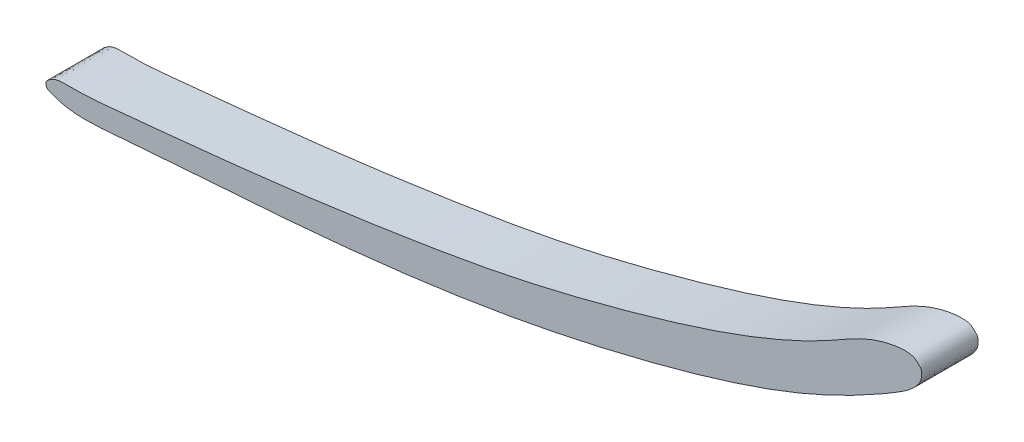
ISO-10303-21;
HEADER;
FILE_DESCRIPTION(('STEP AP214'),'2;1');
FILE_NAME('part.step','',(''),(''),'','','');
FILE_SCHEMA(('AUTOMOTIVE_DESIGN { 1 0 10303 214 1 1 1 1 }'));
ENDSEC;
DATA;
#1=APPLICATION_CONTEXT('core data for automotive mechanical design processes');
#2=APPLICATION_PROTOCOL_DEFINITION('international standard','automotive_design',2000,#1);
#3=PRODUCT_CONTEXT('',#1,'mechanical');
#4=PRODUCT('Part','Part','',(#3));
#5=PRODUCT_RELATED_PRODUCT_CATEGORY('part','',(#4));
#6=PRODUCT_DEFINITION_FORMATION('','',#4);
#7=PRODUCT_DEFINITION_CONTEXT('part definition',#1,'design');
#8=PRODUCT_DEFINITION('design','',#6,#7);
#9=PRODUCT_DEFINITION_SHAPE('','',#8);
#10=(LENGTH_UNIT() NAMED_UNIT(*) SI_UNIT(.MILLI.,.METRE.));
#11=(NAMED_UNIT(*) PLANE_ANGLE_UNIT() SI_UNIT($,.RADIAN.));
#12=(NAMED_UNIT(*) SI_UNIT($,.STERADIAN.) SOLID_ANGLE_UNIT());
#13=UNCERTAINTY_MEASURE_WITH_UNIT(LENGTH_MEASURE(1.E-05),#10,'distance_accuracy_value','');
#14=(GEOMETRIC_REPRESENTATION_CONTEXT(3) GLOBAL_UNCERTAINTY_ASSIGNED_CONTEXT((#13)) GLOBAL_UNIT_ASSIGNED_CONTEXT((#10,
#11,#12)) REPRESENTATION_CONTEXT('',''));
#15=CARTESIAN_POINT('',(0.,0.,0.));
#16=DIRECTION('',(0.,0.,1.));
#17=DIRECTION('',(1.,0.,0.));
#18=AXIS2_PLACEMENT_3D('',#15,#16,#17);
#19=CARTESIAN_POINT('',(71.7110463730999,0.,364.));
#20=CARTESIAN_POINT('',(71.6826823893611,0.0815190251850142,364.));
#21=CARTESIAN_POINT('',(71.6266237909105,0.1468718725404,364.));
#22=CARTESIAN_POINT('',(71.5095659980875,0.270463477702912,364.));
#23=CARTESIAN_POINT('',(71.4474889434878,0.328655276440096,364.));
#24=CARTESIAN_POINT('',(71.2644784652483,0.506502049665254,364.));
#25=CARTESIAN_POINT('',(71.1431501824002,0.627213291922239,364.));
#26=CARTESIAN_POINT('',(70.9442885353693,0.784419450167801,364.));
#27=CARTESIAN_POINT('',(70.8756582462795,0.833233589199096,364.));
#28=CARTESIAN_POINT('',(70.7298489884909,0.917771400414497,364.));
#29=CARTESIAN_POINT('',(70.6524054015472,0.953913066234865,364.));
#30=CARTESIAN_POINT('',(70.4121428243108,1.04475741542546,364.));
#31=CARTESIAN_POINT('',(70.2469684021417,1.0804825401597,364.));
#32=CARTESIAN_POINT('',(69.9117299298198,1.12764023639002,364.));
#33=CARTESIAN_POINT('',(69.7409943569506,1.13842893476638,364.));
#34=CARTESIAN_POINT('',(69.4026718662071,1.14677600139599,364.));
#35=CARTESIAN_POINT('',(69.2341959267308,1.14415403456088,364.));
#36=CARTESIAN_POINT('',(68.7305987217867,1.11813575233603,364.));
#37=CARTESIAN_POINT('',(68.3971793971553,1.07786297450085,364.));
#38=CARTESIAN_POINT('',(67.4001970471249,0.924563521827369,364.));
#39=CARTESIAN_POINT('',(66.7386960094776,0.773876298335404,364.));
#40=CARTESIAN_POINT('',(65.4519109804227,0.405313225348538,364.));
#41=CARTESIAN_POINT('',(64.8234463064744,0.184424089097387,364.));
#42=CARTESIAN_POINT('',(62.9819837299271,-0.585976568661842,364.));
#43=CARTESIAN_POINT('',(61.8087234984953,-1.23385507197639,364.));
#44=CARTESIAN_POINT('',(60.0572352251209,-2.22302600057008,364.));
#45=CARTESIAN_POINT('',(59.4744310407666,-2.55488747156446,364.));
#46=CARTESIAN_POINT('',(58.3024135040043,-3.20524603217316,364.));
#47=CARTESIAN_POINT('',(57.7138380765082,-3.52507332123704,364.));
#48=CARTESIAN_POINT('',(55.933832974948,-4.45478103020228,364.));
#49=CARTESIAN_POINT('',(54.7281349574349,-5.03490913562089,364.));
#50=CARTESIAN_POINT('',(52.290760036954,-6.1409942387378,364.));
#51=CARTESIAN_POINT('',(51.0593053537641,-6.66741460856756,364.));
#52=CARTESIAN_POINT('',(48.5778562798801,-7.68159639597697,364.));
#53=CARTESIAN_POINT('',(47.3270024075177,-8.16861299677987,364.));
#54=CARTESIAN_POINT('',(44.811162190002,-9.09936066738937,364.));
#55=CARTESIAN_POINT('',(43.5458386496495,-9.54407265231509,364.));
#56=CARTESIAN_POINT('',(39.7326969574556,-10.8302867619124,364.));
#57=CARTESIAN_POINT('',(37.1704325957318,-11.6255564712731,364.));
#58=CARTESIAN_POINT('',(32.0250942657534,-13.139915008822,364.));
#59=CARTESIAN_POINT('',(29.440492490279,-13.8574250664785,364.));
#60=CARTESIAN_POINT('',(24.2528965393571,-15.226572169855,364.));
#61=CARTESIAN_POINT('',(21.6512909823673,-15.8782642645095,364.));
#62=CARTESIAN_POINT('',(16.4272268549417,-17.0938264486157,364.));
#63=CARTESIAN_POINT('',(13.8034809147344,-17.6561301617898,364.));
#64=CARTESIAN_POINT('',(8.53809104428089,-18.6846896123403,364.));
#65=CARTESIAN_POINT('',(5.89718270930281,-19.152566043052,364.));
#66=CARTESIAN_POINT('',(0.605261885569547,-20.031233405385,364.));
#67=CARTESIAN_POINT('',(-2.045859173628,-20.4423882509703,364.));
#68=CARTESIAN_POINT('',(-7.35240349730949,-21.2312973276281,364.));
#69=CARTESIAN_POINT('',(-10.0080703830126,-21.6089282829812,364.));
#70=CARTESIAN_POINT('',(-15.3256038266013,-22.3206358194108,364.));
#71=CARTESIAN_POINT('',(-17.9876552653122,-22.6532515298951,364.));
#72=CARTESIAN_POINT('',(-25.9802284643035,-23.5896572650785,364.));
#73=CARTESIAN_POINT('',(-31.3179134140803,-24.133262852807,364.));
#74=CARTESIAN_POINT('',(-37.9905465558041,-24.8050563368816,364.));
#75=CARTESIAN_POINT('',(-39.325096612483,-24.939202318841,364.));
#76=CARTESIAN_POINT('',(-41.3276039573288,-25.1334986591568,364.));
#77=CARTESIAN_POINT('',(-41.9952397373736,-25.1968555085836,364.));
#78=CARTESIAN_POINT('',(-43.3305183230505,-25.3234949848866,364.));
#79=CARTESIAN_POINT('',(-43.9981795543744,-25.38730194809,364.));
#80=CARTESIAN_POINT('',(-45.3346603094167,-25.4988905888166,364.));
#81=CARTESIAN_POINT('',(-46.0035668499774,-25.5445928875663,364.));
#82=CARTESIAN_POINT('',(-47.0090522528061,-25.5809447288611,364.));
#83=CARTESIAN_POINT('',(-47.3443920597968,-25.5882607472695,364.));
#84=CARTESIAN_POINT('',(-48.0149992785612,-25.5908283423368,364.));
#85=CARTESIAN_POINT('',(-48.3503420098542,-25.5845077554029,364.));
#86=CARTESIAN_POINT('',(-49.0210035366732,-25.5765191348239,364.));
#87=CARTESIAN_POINT('',(-49.3569395164505,-25.5766244203838,364.));
#88=CARTESIAN_POINT('',(-50.0257452185457,-25.6136495170355,364.));
#89=CARTESIAN_POINT('',(-50.3576447158298,-25.6481412663198,364.));
#90=CARTESIAN_POINT('',(-50.8430057984961,-25.7795923024063,364.));
#91=CARTESIAN_POINT('',(-51.003207630886,-25.8387829616782,364.));
#92=CARTESIAN_POINT('',(-51.3037587870105,-25.9892887559319,364.));
#93=CARTESIAN_POINT('',(-51.4468011233222,-26.0801141727886,364.));
#94=CARTESIAN_POINT('',(-51.6520553821058,-26.2282317790416,364.));
#95=CARTESIAN_POINT('',(-51.7186182005805,-26.2798659480997,364.));
#96=CARTESIAN_POINT('',(-51.8505208082991,-26.3846251998567,364.));
#97=CARTESIAN_POINT('',(-51.9175078239294,-26.4357422583576,364.));
#98=CARTESIAN_POINT('',(-52.0293085108374,-26.5650064256143,364.));
#99=CARTESIAN_POINT('',(-52.0695253352323,-26.6444123874167,364.));
#100=CARTESIAN_POINT('',(-52.109330656322,-26.8118525836462,364.));
#101=CARTESIAN_POINT('',(-52.1077220635615,-26.8991973317856,364.));
#102=CARTESIAN_POINT('',(-52.0937274881187,-27.0699795499587,364.));
#103=CARTESIAN_POINT('',(-52.0783336832081,-27.1550206580223,364.));
#104=CARTESIAN_POINT('',(-52.0203872612126,-27.3176897760155,364.));
#105=CARTESIAN_POINT('',(-51.9756251624584,-27.3946269810219,364.));
#106=CARTESIAN_POINT('',(-51.8487892206799,-27.5088106100326,364.));
#107=CARTESIAN_POINT('',(-51.7717441739152,-27.5505277508592,364.));
#108=CARTESIAN_POINT('',(-51.6175282964496,-27.6233064141194,364.));
#109=CARTESIAN_POINT('',(-51.5381824462522,-27.6547313302677,364.));
#110=CARTESIAN_POINT('',(-51.2986723342448,-27.7457394585618,364.));
#111=CARTESIAN_POINT('',(-51.1387044750842,-27.8063085211748,364.));
#112=CARTESIAN_POINT('',(-50.8202209253865,-27.9314814488479,364.));
#113=CARTESIAN_POINT('',(-50.6605250326024,-27.9925611433974,364.));
#114=CARTESIAN_POINT('',(-50.1745607522117,-28.1529835709635,364.));
#115=CARTESIAN_POINT('',(-49.8423250497696,-28.2325266748052,364.));
#116=CARTESIAN_POINT('',(-49.1683650558781,-28.3601296192608,364.));
#117=CARTESIAN_POINT('',(-48.8291889331339,-28.4093134225773,364.));
#118=CARTESIAN_POINT('',(-47.1373714936944,-28.6012529987852,364.));
#119=CARTESIAN_POINT('',(-45.7820930096496,-28.5661500590527,364.));
#120=CARTESIAN_POINT('',(-43.748577829334,-28.4517195544269,364.));
#121=CARTESIAN_POINT('',(-43.0704971021039,-28.4011328835337,364.));
#122=CARTESIAN_POINT('',(-41.7148961749027,-28.2934771908754,364.));
#123=CARTESIAN_POINT('',(-41.0374289509592,-28.235628364366,364.));
#124=CARTESIAN_POINT('',(-39.0049791256693,-28.0626629204418,364.));
#125=CARTESIAN_POINT('',(-37.6498108308514,-27.9499430703375,364.));
#126=CARTESIAN_POINT('',(-33.5828248952787,-27.631859429789,364.));
#127=CARTESIAN_POINT('',(-30.8696710611736,-27.4444223180261,364.));
#128=CARTESIAN_POINT('',(-25.4433848204257,-27.0692598154785,364.));
#129=CARTESIAN_POINT('',(-22.7304730591708,-26.8786338865542,364.));
#130=CARTESIAN_POINT('',(-17.3077268605418,-26.4578407084471,364.));
#131=CARTESIAN_POINT('',(-14.5975309875987,-26.2292130019731,364.));
#132=CARTESIAN_POINT('',(-9.18264322358342,-25.7173846178618,364.));
#133=CARTESIAN_POINT('',(-6.47813775558489,-25.4337758573222,364.));
#134=CARTESIAN_POINT('',(1.62525994052721,-24.4875806972633,364.));
#135=CARTESIAN_POINT('',(7.01065730505264,-23.7305612255846,364.));
#136=CARTESIAN_POINT('',(15.0428540571614,-22.3428988840604,364.));
#137=CARTESIAN_POINT('',(17.7130606025507,-21.8380754065063,364.));
#138=CARTESIAN_POINT('',(23.0392941052651,-20.7450954192884,364.));
#139=CARTESIAN_POINT('',(25.6958210829415,-20.1568660321795,364.));
#140=CARTESIAN_POINT('',(30.9894065196995,-18.9028957566566,364.));
#141=CARTESIAN_POINT('',(33.6269256238164,-18.2371130100114,364.));
#142=CARTESIAN_POINT('',(38.8780694957972,-16.8213786690023,364.));
#143=CARTESIAN_POINT('',(41.4930952255965,-16.0707326175609,364.));
#144=CARTESIAN_POINT('',(46.684266959588,-14.44549302457,364.));
#145=CARTESIAN_POINT('',(49.258819234439,-13.5717149279629,364.));
#146=CARTESIAN_POINT('',(54.3433210264919,-11.6363166004547,364.));
#147=CARTESIAN_POINT('',(56.8489989539659,-10.5744689268231,364.));
#148=CARTESIAN_POINT('',(61.7606273744205,-8.23039029971468,364.));
#149=CARTESIAN_POINT('',(64.1642192098757,-6.95151451659952,364.));
#150=CARTESIAN_POINT('',(67.1097059180161,-5.25017284875241,364.));
#151=CARTESIAN_POINT('',(67.6960455378732,-4.90499832055224,364.));
#152=CARTESIAN_POINT('',(68.5639393083742,-4.36844140878258,364.));
#153=CARTESIAN_POINT('',(68.8511242031954,-4.18562847988996,364.));
#154=CARTESIAN_POINT('',(69.4158547169187,-3.80683883605195,364.));
#155=CARTESIAN_POINT('',(69.6937760992403,-3.61164957435053,364.));
#156=CARTESIAN_POINT('',(70.2305733621368,-3.19643731363123,364.));
#157=CARTESIAN_POINT('',(70.4900660759649,-2.97586331920014,364.));
#158=CARTESIAN_POINT('',(70.9729709711751,-2.49346114431243,364.));
#159=CARTESIAN_POINT('',(71.1933397461822,-2.23185431311024,364.));
#160=CARTESIAN_POINT('',(71.470307297556,-1.80168178758975,364.));
#161=CARTESIAN_POINT('',(71.5530724086153,-1.65345252888144,364.));
#162=CARTESIAN_POINT('',(71.6860752842902,-1.34052711023274,364.));
#163=CARTESIAN_POINT('',(71.7367969850085,-1.17325657757321,364.));
#164=CARTESIAN_POINT('',(71.7721039720175,-0.839966576432259,364.));
#165=CARTESIAN_POINT('',(71.757671143863,-0.671584384654109,364.));
#166=CARTESIAN_POINT('',(71.7409117271694,-0.419275837895036,364.));
#167=CARTESIAN_POINT('',(71.7391948925859,-0.335193000799635,364.));
#168=CARTESIAN_POINT('',(71.7371768806201,-0.16672241064171,364.));
#169=CARTESIAN_POINT('',(71.7394103568386,-0.0815190251849985,364.));
#170=CARTESIAN_POINT('',(71.7110463730999,0.,364.));
#171=B_SPLINE_CURVE_WITH_KNOTS('',3,(#19,#20,#21,#22,#23,#24,#25,#26,#27,#28,#29,#30,#31,#32,
#33,#34,#35,#36,#37,#38,#39,#40,#41,#42,#43,#44,#45,#46,#47,#48,#49,#50,#51,#52,#53,#54,#55,#56,
#57,#58,#59,#60,#61,#62,#63,#64,#65,#66,#67,#68,#69,#70,#71,#72,#73,#74,#75,#76,#77,#78,#79,#80,
#81,#82,#83,#84,#85,#86,#87,#88,#89,#90,#91,#92,#93,#94,#95,#96,#97,#98,#99,#100,#101,#102,#103,
#104,#105,#106,#107,#108,#109,#110,#111,#112,#113,#114,#115,#116,#117,#118,#119,#120,#121,#122,
#123,#124,#125,#126,#127,#128,#129,#130,#131,#132,#133,#134,#135,#136,#137,#138,#139,#140,#141,
#142,#143,#144,#145,#146,#147,#148,#149,#150,#151,#152,#153,#154,#155,#156,#157,#158,#159,#160,
#161,#162,#163,#164,#165,#166,#167,#168,#169,#170),.UNSPECIFIED.,.T.,.F.,(4,2,2,2,2,2,2,2,2,2,2,
2,2,2,2,2,2,2,2,2,2,2,2,2,2,2,2,2,2,2,2,2,2,2,2,2,2,2,2,2,2,2,2,2,2,2,2,2,2,2,2,2,2,2,2,2,2,2,2,
2,2,2,2,2,2,2,2,2,2,2,2,2,2,2,2,4),(0.,0.000976562500000064,0.00195312500000013,
0.00390625000000026,0.00488281250000026,0.00585937500000026,0.00781250000000011,
0.00976562499999996,0.0117187499999998,0.0156249999999997,0.0234374999999996,0.0312499999999995,
0.0468749999999991,0.0546874999999989,0.0624999999999987,0.0781249999999983,0.0937499999999979,
0.109374999999997,0.124999999999997,0.156249999999996,0.187499999999995,0.218749999999995,
0.249999999999994,0.281249999999993,0.312499999999993,0.343749999999992,0.374999999999991,
0.43749999999999,0.453124999999989,0.460937499999989,0.468749999999989,0.476562499999989,
0.480468749999989,0.484374999999989,0.488281249999989,0.492187499999989,0.494140624999988,
0.496093749999988,0.497070312499988,0.498046874999988,0.499023437499988,0.499999999999988,
0.500976562499988,0.501953124999988,0.502929687499988,0.503906249999988,0.505859374999988,
0.507812499999989,0.511718749999989,0.515624999999989,0.531249999999989,0.539062499999989,
0.546874999999989,0.56249999999999,0.59374999999999,0.624999999999991,0.656249999999992,
0.687499999999993,0.749999999999994,0.781249999999995,0.812499999999995,0.843749999999996,
0.874999999999997,0.906249999999998,0.937499999999998,0.968749999999999,0.976562499999999,
0.980468749999999,0.984375,0.98828125,0.9921875,0.994140625,0.99609375,0.998046875,0.9990234375,
1.),.UNSPECIFIED.);
#172=DIRECTION('',(0.,0.,-1.));
#173=VECTOR('',#172,1.);
#174=SURFACE_OF_LINEAR_EXTRUSION('',#171,#173);
#175=CARTESIAN_POINT('',(71.7110463730999,0.,364.));
#176=CARTESIAN_POINT('',(71.7394103568386,-0.0815190251849985,364.));
#177=CARTESIAN_POINT('',(71.7371768806201,-0.16672241064171,364.));
#178=CARTESIAN_POINT('',(71.7391948925859,-0.335193000799635,364.));
#179=CARTESIAN_POINT('',(71.7409117271694,-0.419275837895036,364.));
#180=CARTESIAN_POINT('',(71.757671143863,-0.671584384654109,364.));
#181=CARTESIAN_POINT('',(71.7721039720175,-0.839966576432259,364.));
#182=CARTESIAN_POINT('',(71.7367969850085,-1.17325657757321,364.));
#183=CARTESIAN_POINT('',(71.6860752842902,-1.34052711023274,364.));
#184=CARTESIAN_POINT('',(71.5530724086153,-1.65345252888144,364.));
#185=CARTESIAN_POINT('',(71.470307297556,-1.80168178758975,364.));
#186=CARTESIAN_POINT('',(71.1933397461822,-2.23185431311024,364.));
#187=CARTESIAN_POINT('',(70.9729709711751,-2.49346114431243,364.));
#188=CARTESIAN_POINT('',(70.4900660759649,-2.97586331920014,364.));
#189=CARTESIAN_POINT('',(70.2305733621368,-3.19643731363123,364.));
#190=CARTESIAN_POINT('',(69.6937760992403,-3.61164957435053,364.));
#191=CARTESIAN_POINT('',(69.4158547169187,-3.80683883605195,364.));
#192=CARTESIAN_POINT('',(68.8511242031954,-4.18562847988996,364.));
#193=CARTESIAN_POINT('',(68.5639393083742,-4.36844140878258,364.));
#194=CARTESIAN_POINT('',(67.6960455378732,-4.90499832055224,364.));
#195=CARTESIAN_POINT('',(67.1097059180161,-5.25017284875241,364.));
#196=CARTESIAN_POINT('',(64.1642192098757,-6.95151451659952,364.));
#197=CARTESIAN_POINT('',(61.7606273744205,-8.23039029971468,364.));
#198=CARTESIAN_POINT('',(56.8489989539659,-10.5744689268231,364.));
#199=CARTESIAN_POINT('',(54.3433210264919,-11.6363166004547,364.));
#200=CARTESIAN_POINT('',(49.258819234439,-13.5717149279629,364.));
#201=CARTESIAN_POINT('',(46.684266959588,-14.44549302457,364.));
#202=CARTESIAN_POINT('',(41.4930952255965,-16.0707326175609,364.));
#203=CARTESIAN_POINT('',(38.8780694957972,-16.8213786690023,364.));
#204=CARTESIAN_POINT('',(33.6269256238164,-18.2371130100114,364.));
#205=CARTESIAN_POINT('',(30.9894065196995,-18.9028957566566,364.));
#206=CARTESIAN_POINT('',(25.6958210829415,-20.1568660321795,364.));
#207=CARTESIAN_POINT('',(23.0392941052651,-20.7450954192884,364.));
#208=CARTESIAN_POINT('',(17.7130606025507,-21.8380754065063,364.));
#209=CARTESIAN_POINT('',(15.0428540571614,-22.3428988840604,364.));
#210=CARTESIAN_POINT('',(7.01065730505264,-23.7305612255846,364.));
#211=CARTESIAN_POINT('',(1.62525994052721,-24.4875806972633,364.));
#212=CARTESIAN_POINT('',(-6.47813775558489,-25.4337758573222,364.));
#213=CARTESIAN_POINT('',(-9.18264322358342,-25.7173846178618,364.));
#214=CARTESIAN_POINT('',(-14.5975309875987,-26.2292130019731,364.));
#215=CARTESIAN_POINT('',(-17.3077268605418,-26.4578407084471,364.));
#216=CARTESIAN_POINT('',(-22.7304730591708,-26.8786338865542,364.));
#217=CARTESIAN_POINT('',(-25.4433848204257,-27.0692598154785,364.));
#218=CARTESIAN_POINT('',(-30.8696710611736,-27.4444223180261,364.));
#219=CARTESIAN_POINT('',(-33.5828248952787,-27.631859429789,364.));
#220=CARTESIAN_POINT('',(-37.6498108308514,-27.9499430703375,364.));
#221=CARTESIAN_POINT('',(-39.0049791256693,-28.0626629204418,364.));
#222=CARTESIAN_POINT('',(-41.0374289509592,-28.235628364366,364.));
#223=CARTESIAN_POINT('',(-41.7148961749027,-28.2934771908754,364.));
#224=CARTESIAN_POINT('',(-43.0704971021039,-28.4011328835337,364.));
#225=CARTESIAN_POINT('',(-43.748577829334,-28.4517195544269,364.));
#226=CARTESIAN_POINT('',(-45.7820930096496,-28.5661500590527,364.));
#227=CARTESIAN_POINT('',(-47.1373714936944,-28.6012529987852,364.));
#228=CARTESIAN_POINT('',(-48.8291889331339,-28.4093134225773,364.));
#229=CARTESIAN_POINT('',(-49.1683650558781,-28.3601296192608,364.));
#230=CARTESIAN_POINT('',(-49.8423250497696,-28.2325266748052,364.));
#231=CARTESIAN_POINT('',(-50.1745607522117,-28.1529835709635,364.));
#232=CARTESIAN_POINT('',(-50.6605250326024,-27.9925611433974,364.));
#233=CARTESIAN_POINT('',(-50.8202209253865,-27.9314814488479,364.));
#234=CARTESIAN_POINT('',(-51.1387044750842,-27.8063085211748,364.));
#235=CARTESIAN_POINT('',(-51.2986723342448,-27.7457394585618,364.));
#236=CARTESIAN_POINT('',(-51.5381824462522,-27.6547313302677,364.));
#237=CARTESIAN_POINT('',(-51.6175282964496,-27.6233064141194,364.));
#238=CARTESIAN_POINT('',(-51.7717441739152,-27.5505277508592,364.));
#239=CARTESIAN_POINT('',(-51.8487892206799,-27.5088106100326,364.));
#240=CARTESIAN_POINT('',(-51.9756251624584,-27.3946269810219,364.));
#241=CARTESIAN_POINT('',(-52.0203872612126,-27.3176897760155,364.));
#242=CARTESIAN_POINT('',(-52.0783336832081,-27.1550206580223,364.));
#243=CARTESIAN_POINT('',(-52.0937274881187,-27.0699795499587,364.));
#244=CARTESIAN_POINT('',(-52.1077220635615,-26.8991973317856,364.));
#245=CARTESIAN_POINT('',(-52.109330656322,-26.8118525836462,364.));
#246=CARTESIAN_POINT('',(-52.0695253352323,-26.6444123874167,364.));
#247=CARTESIAN_POINT('',(-52.0293085108374,-26.5650064256143,364.));
#248=CARTESIAN_POINT('',(-51.9175078239294,-26.4357422583576,364.));
#249=CARTESIAN_POINT('',(-51.8505208082991,-26.3846251998567,364.));
#250=CARTESIAN_POINT('',(-51.7186182005805,-26.2798659480997,364.));
#251=CARTESIAN_POINT('',(-51.6520553821058,-26.2282317790416,364.));
#252=CARTESIAN_POINT('',(-51.4468011233222,-26.0801141727886,364.));
#253=CARTESIAN_POINT('',(-51.3037587870105,-25.9892887559319,364.));
#254=CARTESIAN_POINT('',(-51.003207630886,-25.8387829616782,364.));
#255=CARTESIAN_POINT('',(-50.8430057984961,-25.7795923024063,364.));
#256=CARTESIAN_POINT('',(-50.3576447158298,-25.6481412663198,364.));
#257=CARTESIAN_POINT('',(-50.0257452185457,-25.6136495170355,364.));
#258=CARTESIAN_POINT('',(-49.3569395164505,-25.5766244203838,364.));
#259=CARTESIAN_POINT('',(-49.0210035366732,-25.5765191348239,364.));
#260=CARTESIAN_POINT('',(-48.3503420098542,-25.5845077554029,364.));
#261=CARTESIAN_POINT('',(-48.0149992785612,-25.5908283423368,364.));
#262=CARTESIAN_POINT('',(-47.3443920597968,-25.5882607472695,364.));
#263=CARTESIAN_POINT('',(-47.0090522528061,-25.5809447288611,364.));
#264=CARTESIAN_POINT('',(-46.0035668499774,-25.5445928875663,364.));
#265=CARTESIAN_POINT('',(-45.3346603094167,-25.4988905888166,364.));
#266=CARTESIAN_POINT('',(-43.9981795543744,-25.38730194809,364.));
#267=CARTESIAN_POINT('',(-43.3305183230505,-25.3234949848866,364.));
#268=CARTESIAN_POINT('',(-41.9952397373736,-25.1968555085836,364.));
#269=CARTESIAN_POINT('',(-41.3276039573288,-25.1334986591568,364.));
#270=CARTESIAN_POINT('',(-39.325096612483,-24.939202318841,364.));
#271=CARTESIAN_POINT('',(-37.9905465558041,-24.8050563368816,364.));
#272=CARTESIAN_POINT('',(-31.3179134140803,-24.133262852807,364.));
#273=CARTESIAN_POINT('',(-25.9802284643035,-23.5896572650785,364.));
#274=CARTESIAN_POINT('',(-17.9876552653122,-22.6532515298951,364.));
#275=CARTESIAN_POINT('',(-15.3256038266013,-22.3206358194108,364.));
#276=CARTESIAN_POINT('',(-10.0080703830126,-21.6089282829812,364.));
#277=CARTESIAN_POINT('',(-7.35240349730949,-21.2312973276281,364.));
#278=CARTESIAN_POINT('',(-2.045859173628,-20.4423882509703,364.));
#279=CARTESIAN_POINT('',(0.605261885569547,-20.031233405385,364.));
#280=CARTESIAN_POINT('',(5.89718270930281,-19.152566043052,364.));
#281=CARTESIAN_POINT('',(8.53809104428089,-18.6846896123403,364.));
#282=CARTESIAN_POINT('',(13.8034809147344,-17.6561301617898,364.));
#283=CARTESIAN_POINT('',(16.4272268549417,-17.0938264486157,364.));
#284=CARTESIAN_POINT('',(21.6512909823673,-15.8782642645095,364.));
#285=CARTESIAN_POINT('',(24.2528965393571,-15.226572169855,364.));
#286=CARTESIAN_POINT('',(29.440492490279,-13.8574250664785,364.));
#287=CARTESIAN_POINT('',(32.0250942657534,-13.139915008822,364.));
#288=CARTESIAN_POINT('',(37.1704325957318,-11.6255564712731,364.));
#289=CARTESIAN_POINT('',(39.7326969574556,-10.8302867619124,364.));
#290=CARTESIAN_POINT('',(43.5458386496495,-9.54407265231509,364.));
#291=CARTESIAN_POINT('',(44.811162190002,-9.09936066738937,364.));
#292=CARTESIAN_POINT('',(47.3270024075177,-8.16861299677987,364.));
#293=CARTESIAN_POINT('',(48.5778562798801,-7.68159639597697,364.));
#294=CARTESIAN_POINT('',(51.0593053537641,-6.66741460856756,364.));
#295=CARTESIAN_POINT('',(52.290760036954,-6.1409942387378,364.));
#296=CARTESIAN_POINT('',(54.7281349574349,-5.03490913562089,364.));
#297=CARTESIAN_POINT('',(55.933832974948,-4.45478103020228,364.));
#298=CARTESIAN_POINT('',(57.7138380765082,-3.52507332123704,364.));
#299=CARTESIAN_POINT('',(58.3024135040043,-3.20524603217316,364.));
#300=CARTESIAN_POINT('',(59.4744310407666,-2.55488747156446,364.));
#301=CARTESIAN_POINT('',(60.0572352251209,-2.22302600057008,364.));
#302=CARTESIAN_POINT('',(61.8087234984953,-1.23385507197639,364.));
#303=CARTESIAN_POINT('',(62.9819837299271,-0.585976568661842,364.));
#304=CARTESIAN_POINT('',(64.8234463064744,0.184424089097387,364.));
#305=CARTESIAN_POINT('',(65.4519109804227,0.405313225348538,364.));
#306=CARTESIAN_POINT('',(66.7386960094776,0.773876298335404,364.));
#307=CARTESIAN_POINT('',(67.4001970471249,0.924563521827369,364.));
#308=CARTESIAN_POINT('',(68.3971793971553,1.07786297450085,364.));
#309=CARTESIAN_POINT('',(68.7305987217867,1.11813575233603,364.));
#310=CARTESIAN_POINT('',(69.2341959267308,1.14415403456088,364.));
#311=CARTESIAN_POINT('',(69.4026718662071,1.14677600139599,364.));
#312=CARTESIAN_POINT('',(69.7409943569506,1.13842893476638,364.));
#313=CARTESIAN_POINT('',(69.9117299298198,1.12764023639002,364.));
#314=CARTESIAN_POINT('',(70.2469684021417,1.0804825401597,364.));
#315=CARTESIAN_POINT('',(70.4121428243108,1.04475741542546,364.));
#316=CARTESIAN_POINT('',(70.6524054015472,0.953913066234865,364.));
#317=CARTESIAN_POINT('',(70.7298489884909,0.917771400414497,364.));
#318=CARTESIAN_POINT('',(70.8756582462795,0.833233589199096,364.));
#319=CARTESIAN_POINT('',(70.9442885353693,0.784419450167801,364.));
#320=CARTESIAN_POINT('',(71.1431501824002,0.627213291922239,364.));
#321=CARTESIAN_POINT('',(71.2644784652483,0.506502049665254,364.));
#322=CARTESIAN_POINT('',(71.4474889434878,0.328655276440096,364.));
#323=CARTESIAN_POINT('',(71.5095659980875,0.270463477702912,364.));
#324=CARTESIAN_POINT('',(71.6266237909105,0.1468718725404,364.));
#325=CARTESIAN_POINT('',(71.6826823893611,0.0815190251850142,364.));
#326=CARTESIAN_POINT('',(71.7110463730999,0.,364.));
#327=B_SPLINE_CURVE_WITH_KNOTS('',3,(#175,#176,#177,#178,#179,#180,#181,#182,#183,#184,#185,
#186,#187,#188,#189,#190,#191,#192,#193,#194,#195,#196,#197,#198,#199,#200,#201,#202,#203,#204,
#205,#206,#207,#208,#209,#210,#211,#212,#213,#214,#215,#216,#217,#218,#219,#220,#221,#222,#223,
#224,#225,#226,#227,#228,#229,#230,#231,#232,#233,#234,#235,#236,#237,#238,#239,#240,#241,#242,
#243,#244,#245,#246,#247,#248,#249,#250,#251,#252,#253,#254,#255,#256,#257,#258,#259,#260,#261,
#262,#263,#264,#265,#266,#267,#268,#269,#270,#271,#272,#273,#274,#275,#276,#277,#278,#279,#280,
#281,#282,#283,#284,#285,#286,#287,#288,#289,#290,#291,#292,#293,#294,#295,#296,#297,#298,#299,
#300,#301,#302,#303,#304,#305,#306,#307,#308,#309,#310,#311,#312,#313,#314,#315,#316,#317,#318,
#319,#320,#321,#322,#323,#324,#325,#326),.UNSPECIFIED.,.T.,.F.,(4,2,2,2,2,2,2,2,2,2,2,2,2,2,2,2,
2,2,2,2,2,2,2,2,2,2,2,2,2,2,2,2,2,2,2,2,2,2,2,2,2,2,2,2,2,2,2,2,2,2,2,2,2,2,2,2,2,2,2,2,2,2,2,2,
2,2,2,2,2,2,2,2,2,2,2,4),(0.,0.0009765625,0.001953125,0.00390625,0.005859375,
0.00781250000000011,0.0117187500000002,0.0156250000000003,0.0195312500000006,0.0234375000000007,
0.0312500000000008,0.0625000000000017,0.0937500000000023,0.125000000000003,0.156250000000004,
0.187500000000005,0.218750000000005,0.250000000000006,0.312500000000007,0.343750000000008,
0.375000000000009,0.40625000000001,0.43750000000001,0.453125000000011,0.460937500000011,
0.468750000000011,0.484375000000011,0.488281250000011,0.492187500000011,0.494140625000012,
0.496093750000012,0.497070312500012,0.498046875000012,0.499023437500012,0.500000000000012,
0.500976562500012,0.501953125000012,0.502929687500012,0.503906250000012,0.505859375000012,
0.507812500000012,0.511718750000011,0.515625000000011,0.519531250000011,0.523437500000011,
0.531250000000011,0.539062500000011,0.546875000000011,0.56250000000001,0.625000000000009,
0.656250000000008,0.687500000000007,0.718750000000007,0.750000000000006,0.781250000000005,
0.812500000000005,0.843750000000004,0.875000000000003,0.890625000000003,0.906250000000002,
0.921875000000002,0.937500000000001,0.945312500000001,0.953125000000001,0.968750000000001,
0.9765625,0.984375,0.98828125,0.990234375,0.9921875,0.994140625,0.9951171875,0.99609375,
0.998046875,0.9990234375,1.),.UNSPECIFIED.);
#328=CARTESIAN_POINT('',(71.7110463730999,0.,364.));
#329=VERTEX_POINT('',#328);
#330=EDGE_CURVE('E10',#329,#329,#327,.F.);
#331=ORIENTED_EDGE('',*,*,#330,.F.);
#332=EDGE_LOOP('',(#331));
#333=FACE_BOUND('',#332,.T.);
#334=CARTESIAN_POINT('',(71.7110463730999,0.,356.000000000001));
#335=CARTESIAN_POINT('',(71.6826823893611,0.0815190251850142,356.000000000001));
#336=CARTESIAN_POINT('',(71.6266237909105,0.1468718725404,356.000000000001));
#337=CARTESIAN_POINT('',(71.5095659980875,0.270463477702912,356.000000000001));
#338=CARTESIAN_POINT('',(71.4474889434878,0.328655276440096,356.000000000001));
#339=CARTESIAN_POINT('',(71.2644784652483,0.506502049665254,356.000000000001));
#340=CARTESIAN_POINT('',(71.1431501824002,0.627213291922239,356.000000000001));
#341=CARTESIAN_POINT('',(70.9442885353693,0.784419450167801,356.000000000001));
#342=CARTESIAN_POINT('',(70.8756582462795,0.833233589199096,356.000000000001));
#343=CARTESIAN_POINT('',(70.7298489884909,0.917771400414497,356.000000000001));
#344=CARTESIAN_POINT('',(70.6524054015472,0.953913066234865,356.000000000001));
#345=CARTESIAN_POINT('',(70.4121428243108,1.04475741542546,356.000000000001));
#346=CARTESIAN_POINT('',(70.2469684021417,1.0804825401597,356.000000000001));
#347=CARTESIAN_POINT('',(69.9117299298198,1.12764023639002,356.000000000001));
#348=CARTESIAN_POINT('',(69.7409943569506,1.13842893476638,356.000000000001));
#349=CARTESIAN_POINT('',(69.4026718662071,1.14677600139599,356.000000000001));
#350=CARTESIAN_POINT('',(69.2341959267308,1.14415403456088,356.000000000001));
#351=CARTESIAN_POINT('',(68.7305987217867,1.11813575233603,356.000000000001));
#352=CARTESIAN_POINT('',(68.3971793971553,1.07786297450085,356.000000000001));
#353=CARTESIAN_POINT('',(67.4001970471249,0.924563521827369,356.000000000001));
#354=CARTESIAN_POINT('',(66.7386960094776,0.773876298335404,356.000000000001));
#355=CARTESIAN_POINT('',(65.4519109804227,0.405313225348538,356.000000000001));
#356=CARTESIAN_POINT('',(64.8234463064744,0.184424089097387,356.000000000001));
#357=CARTESIAN_POINT('',(62.9819837299271,-0.585976568661842,356.000000000001));
#358=CARTESIAN_POINT('',(61.8087234984953,-1.23385507197639,356.000000000001));
#359=CARTESIAN_POINT('',(60.0572352251209,-2.22302600057008,356.000000000001));
#360=CARTESIAN_POINT('',(59.4744310407666,-2.55488747156446,356.000000000001));
#361=CARTESIAN_POINT('',(58.3024135040043,-3.20524603217316,356.000000000001));
#362=CARTESIAN_POINT('',(57.7138380765082,-3.52507332123704,356.000000000001));
#363=CARTESIAN_POINT('',(55.933832974948,-4.45478103020228,356.000000000001));
#364=CARTESIAN_POINT('',(54.7281349574349,-5.03490913562089,356.000000000001));
#365=CARTESIAN_POINT('',(52.290760036954,-6.1409942387378,356.000000000001));
#366=CARTESIAN_POINT('',(51.0593053537641,-6.66741460856756,356.000000000001));
#367=CARTESIAN_POINT('',(48.5778562798801,-7.68159639597697,356.000000000001));
#368=CARTESIAN_POINT('',(47.3270024075177,-8.16861299677987,356.000000000001));
#369=CARTESIAN_POINT('',(44.811162190002,-9.09936066738937,356.000000000001));
#370=CARTESIAN_POINT('',(43.5458386496495,-9.54407265231509,356.000000000001));
#371=CARTESIAN_POINT('',(39.7326969574556,-10.8302867619124,356.000000000001));
#372=CARTESIAN_POINT('',(37.1704325957318,-11.6255564712731,356.000000000001));
#373=CARTESIAN_POINT('',(32.0250942657534,-13.139915008822,356.000000000001));
#374=CARTESIAN_POINT('',(29.440492490279,-13.8574250664785,356.000000000001));
#375=CARTESIAN_POINT('',(24.2528965393571,-15.226572169855,356.000000000001));
#376=CARTESIAN_POINT('',(21.6512909823673,-15.8782642645095,356.000000000001));
#377=CARTESIAN_POINT('',(16.4272268549417,-17.0938264486157,356.000000000001));
#378=CARTESIAN_POINT('',(13.8034809147344,-17.6561301617898,356.000000000001));
#379=CARTESIAN_POINT('',(8.53809104428089,-18.6846896123403,356.000000000001));
#380=CARTESIAN_POINT('',(5.89718270930281,-19.152566043052,356.000000000001));
#381=CARTESIAN_POINT('',(0.605261885569547,-20.031233405385,356.000000000001));
#382=CARTESIAN_POINT('',(-2.045859173628,-20.4423882509703,356.000000000001));
#383=CARTESIAN_POINT('',(-7.35240349730949,-21.2312973276281,356.000000000001));
#384=CARTESIAN_POINT('',(-10.0080703830126,-21.6089282829812,356.000000000001));
#385=CARTESIAN_POINT('',(-15.3256038266013,-22.3206358194108,356.000000000001));
#386=CARTESIAN_POINT('',(-17.9876552653122,-22.6532515298951,356.000000000001));
#387=CARTESIAN_POINT('',(-25.9802284643035,-23.5896572650785,356.000000000001));
#388=CARTESIAN_POINT('',(-31.3179134140803,-24.133262852807,356.000000000001));
#389=CARTESIAN_POINT('',(-37.9905465558041,-24.8050563368816,356.000000000001));
#390=CARTESIAN_POINT('',(-39.325096612483,-24.939202318841,356.000000000001));
#391=CARTESIAN_POINT('',(-41.3276039573288,-25.1334986591568,356.000000000001));
#392=CARTESIAN_POINT('',(-41.9952397373736,-25.1968555085836,356.000000000001));
#393=CARTESIAN_POINT('',(-43.3305183230505,-25.3234949848866,356.000000000001));
#394=CARTESIAN_POINT('',(-43.9981795543744,-25.38730194809,356.000000000001));
#395=CARTESIAN_POINT('',(-45.3346603094167,-25.4988905888166,356.000000000001));
#396=CARTESIAN_POINT('',(-46.0035668499774,-25.5445928875663,356.000000000001));
#397=CARTESIAN_POINT('',(-47.0090522528061,-25.5809447288611,356.000000000001));
#398=CARTESIAN_POINT('',(-47.3443920597968,-25.5882607472695,356.000000000001));
#399=CARTESIAN_POINT('',(-48.0149992785612,-25.5908283423368,356.000000000001));
#400=CARTESIAN_POINT('',(-48.3503420098542,-25.5845077554029,356.000000000001));
#401=CARTESIAN_POINT('',(-49.0210035366732,-25.5765191348239,356.000000000001));
#402=CARTESIAN_POINT('',(-49.3569395164505,-25.5766244203838,356.000000000001));
#403=CARTESIAN_POINT('',(-50.0257452185457,-25.6136495170355,356.000000000001));
#404=CARTESIAN_POINT('',(-50.3576447158298,-25.6481412663198,356.000000000001));
#405=CARTESIAN_POINT('',(-50.8430057984961,-25.7795923024063,356.000000000001));
#406=CARTESIAN_POINT('',(-51.003207630886,-25.8387829616782,356.000000000001));
#407=CARTESIAN_POINT('',(-51.3037587870105,-25.9892887559319,356.000000000001));
#408=CARTESIAN_POINT('',(-51.4468011233222,-26.0801141727886,356.000000000001));
#409=CARTESIAN_POINT('',(-51.6520553821058,-26.2282317790416,356.000000000001));
#410=CARTESIAN_POINT('',(-51.7186182005805,-26.2798659480997,356.000000000001));
#411=CARTESIAN_POINT('',(-51.8505208082991,-26.3846251998567,356.000000000001));
#412=CARTESIAN_POINT('',(-51.9175078239294,-26.4357422583576,356.000000000001));
#413=CARTESIAN_POINT('',(-52.0293085108374,-26.5650064256143,356.000000000001));
#414=CARTESIAN_POINT('',(-52.0695253352323,-26.6444123874167,356.000000000001));
#415=CARTESIAN_POINT('',(-52.109330656322,-26.8118525836462,356.000000000001));
#416=CARTESIAN_POINT('',(-52.1077220635615,-26.8991973317856,356.000000000001));
#417=CARTESIAN_POINT('',(-52.0937274881187,-27.0699795499587,356.000000000001));
#418=CARTESIAN_POINT('',(-52.0783336832081,-27.1550206580223,356.000000000001));
#419=CARTESIAN_POINT('',(-52.0203872612126,-27.3176897760155,356.000000000001));
#420=CARTESIAN_POINT('',(-51.9756251624584,-27.3946269810219,356.000000000001));
#421=CARTESIAN_POINT('',(-51.8487892206799,-27.5088106100326,356.000000000001));
#422=CARTESIAN_POINT('',(-51.7717441739152,-27.5505277508592,356.000000000001));
#423=CARTESIAN_POINT('',(-51.6175282964496,-27.6233064141194,356.000000000001));
#424=CARTESIAN_POINT('',(-51.5381824462522,-27.6547313302677,356.000000000001));
#425=CARTESIAN_POINT('',(-51.2986723342448,-27.7457394585618,356.000000000001));
#426=CARTESIAN_POINT('',(-51.1387044750842,-27.8063085211748,356.000000000001));
#427=CARTESIAN_POINT('',(-50.8202209253865,-27.9314814488479,356.000000000001));
#428=CARTESIAN_POINT('',(-50.6605250326024,-27.9925611433974,356.000000000001));
#429=CARTESIAN_POINT('',(-50.1745607522117,-28.1529835709635,356.000000000001));
#430=CARTESIAN_POINT('',(-49.8423250497696,-28.2325266748052,356.000000000001));
#431=CARTESIAN_POINT('',(-49.1683650558781,-28.3601296192608,356.000000000001));
#432=CARTESIAN_POINT('',(-48.8291889331339,-28.4093134225773,356.000000000001));
#433=CARTESIAN_POINT('',(-47.1373714936944,-28.6012529987852,356.000000000001));
#434=CARTESIAN_POINT('',(-45.7820930096496,-28.5661500590527,356.000000000001));
#435=CARTESIAN_POINT('',(-43.748577829334,-28.4517195544269,356.000000000001));
#436=CARTESIAN_POINT('',(-43.0704971021039,-28.4011328835337,356.000000000001));
#437=CARTESIAN_POINT('',(-41.7148961749027,-28.2934771908754,356.000000000001));
#438=CARTESIAN_POINT('',(-41.0374289509592,-28.235628364366,356.000000000001));
#439=CARTESIAN_POINT('',(-39.0049791256693,-28.0626629204418,356.000000000001));
#440=CARTESIAN_POINT('',(-37.6498108308514,-27.9499430703375,356.000000000001));
#441=CARTESIAN_POINT('',(-33.5828248952787,-27.631859429789,356.000000000001));
#442=CARTESIAN_POINT('',(-30.8696710611736,-27.4444223180261,356.000000000001));
#443=CARTESIAN_POINT('',(-25.4433848204257,-27.0692598154785,356.000000000001));
#444=CARTESIAN_POINT('',(-22.7304730591708,-26.8786338865542,356.000000000001));
#445=CARTESIAN_POINT('',(-17.3077268605418,-26.4578407084471,356.000000000001));
#446=CARTESIAN_POINT('',(-14.5975309875987,-26.2292130019731,356.000000000001));
#447=CARTESIAN_POINT('',(-9.18264322358342,-25.7173846178618,356.000000000001));
#448=CARTESIAN_POINT('',(-6.47813775558489,-25.4337758573222,356.000000000001));
#449=CARTESIAN_POINT('',(1.62525994052721,-24.4875806972633,356.000000000001));
#450=CARTESIAN_POINT('',(7.01065730505264,-23.7305612255846,356.000000000001));
#451=CARTESIAN_POINT('',(15.0428540571614,-22.3428988840604,356.000000000001));
#452=CARTESIAN_POINT('',(17.7130606025507,-21.8380754065063,356.000000000001));
#453=CARTESIAN_POINT('',(23.0392941052651,-20.7450954192884,356.000000000001));
#454=CARTESIAN_POINT('',(25.6958210829415,-20.1568660321795,356.000000000001));
#455=CARTESIAN_POINT('',(30.9894065196995,-18.9028957566566,356.000000000001));
#456=CARTESIAN_POINT('',(33.6269256238164,-18.2371130100114,356.000000000001));
#457=CARTESIAN_POINT('',(38.8780694957972,-16.8213786690023,356.000000000001));
#458=CARTESIAN_POINT('',(41.4930952255965,-16.0707326175609,356.000000000001));
#459=CARTESIAN_POINT('',(46.684266959588,-14.44549302457,356.000000000001));
#460=CARTESIAN_POINT('',(49.258819234439,-13.5717149279629,356.000000000001));
#461=CARTESIAN_POINT('',(54.3433210264919,-11.6363166004547,356.000000000001));
#462=CARTESIAN_POINT('',(56.8489989539659,-10.5744689268231,356.000000000001));
#463=CARTESIAN_POINT('',(61.7606273744205,-8.23039029971468,356.000000000001));
#464=CARTESIAN_POINT('',(64.1642192098757,-6.95151451659952,356.000000000001));
#465=CARTESIAN_POINT('',(67.1097059180161,-5.25017284875241,356.000000000001));
#466=CARTESIAN_POINT('',(67.6960455378732,-4.90499832055224,356.000000000001));
#467=CARTESIAN_POINT('',(68.5639393083742,-4.36844140878258,356.000000000001));
#468=CARTESIAN_POINT('',(68.8511242031954,-4.18562847988996,356.000000000001));
#469=CARTESIAN_POINT('',(69.4158547169187,-3.80683883605195,356.000000000001));
#470=CARTESIAN_POINT('',(69.6937760992403,-3.61164957435053,356.000000000001));
#471=CARTESIAN_POINT('',(70.2305733621368,-3.19643731363123,356.000000000001));
#472=CARTESIAN_POINT('',(70.4900660759649,-2.97586331920014,356.000000000001));
#473=CARTESIAN_POINT('',(70.9729709711751,-2.49346114431243,356.000000000001));
#474=CARTESIAN_POINT('',(71.1933397461822,-2.23185431311024,356.000000000001));
#475=CARTESIAN_POINT('',(71.470307297556,-1.80168178758975,356.000000000001));
#476=CARTESIAN_POINT('',(71.5530724086153,-1.65345252888144,356.000000000001));
#477=CARTESIAN_POINT('',(71.6860752842902,-1.34052711023274,356.000000000001));
#478=CARTESIAN_POINT('',(71.7367969850085,-1.17325657757321,356.000000000001));
#479=CARTESIAN_POINT('',(71.7721039720175,-0.839966576432259,356.000000000001));
#480=CARTESIAN_POINT('',(71.757671143863,-0.671584384654109,356.000000000001));
#481=CARTESIAN_POINT('',(71.7409117271694,-0.419275837895036,356.000000000001));
#482=CARTESIAN_POINT('',(71.7391948925859,-0.335193000799635,356.000000000001));
#483=CARTESIAN_POINT('',(71.7371768806201,-0.16672241064171,356.000000000001));
#484=CARTESIAN_POINT('',(71.7394103568386,-0.0815190251849985,356.000000000001));
#485=CARTESIAN_POINT('',(71.7110463730999,0.,356.000000000001));
#486=B_SPLINE_CURVE_WITH_KNOTS('',3,(#334,#335,#336,#337,#338,#339,#340,#341,#342,#343,#344,
#345,#346,#347,#348,#349,#350,#351,#352,#353,#354,#355,#356,#357,#358,#359,#360,#361,#362,#363,
#364,#365,#366,#367,#368,#369,#370,#371,#372,#373,#374,#375,#376,#377,#378,#379,#380,#381,#382,
#383,#384,#385,#386,#387,#388,#389,#390,#391,#392,#393,#394,#395,#396,#397,#398,#399,#400,#401,
#402,#403,#404,#405,#406,#407,#408,#409,#410,#411,#412,#413,#414,#415,#416,#417,#418,#419,#420,
#421,#422,#423,#424,#425,#426,#427,#428,#429,#430,#431,#432,#433,#434,#435,#436,#437,#438,#439,
#440,#441,#442,#443,#444,#445,#446,#447,#448,#449,#450,#451,#452,#453,#454,#455,#456,#457,#458,
#459,#460,#461,#462,#463,#464,#465,#466,#467,#468,#469,#470,#471,#472,#473,#474,#475,#476,#477,
#478,#479,#480,#481,#482,#483,#484,#485),.UNSPECIFIED.,.T.,.F.,(4,2,2,2,2,2,2,2,2,2,2,2,2,2,2,2,
2,2,2,2,2,2,2,2,2,2,2,2,2,2,2,2,2,2,2,2,2,2,2,2,2,2,2,2,2,2,2,2,2,2,2,2,2,2,2,2,2,2,2,2,2,2,2,2,
2,2,2,2,2,2,2,2,2,2,2,4),(0.,0.000976562500000064,0.00195312500000013,0.00390625000000026,
0.00488281250000026,0.00585937500000026,0.00781250000000011,0.00976562499999996,
0.0117187499999998,0.0156249999999997,0.0234374999999996,0.0312499999999995,0.0468749999999991,
0.0546874999999989,0.0624999999999987,0.0781249999999983,0.0937499999999979,0.109374999999997,
0.124999999999997,0.156249999999996,0.187499999999995,0.218749999999995,0.249999999999994,
0.281249999999993,0.312499999999993,0.343749999999992,0.374999999999991,0.43749999999999,
0.453124999999989,0.460937499999989,0.468749999999989,0.476562499999989,0.480468749999989,
0.484374999999989,0.488281249999989,0.492187499999989,0.494140624999988,0.496093749999988,
0.497070312499988,0.498046874999988,0.499023437499988,0.499999999999988,0.500976562499988,
0.501953124999988,0.502929687499988,0.503906249999988,0.505859374999988,0.507812499999989,
0.511718749999989,0.515624999999989,0.531249999999989,0.539062499999989,0.546874999999989,
0.56249999999999,0.59374999999999,0.624999999999991,0.656249999999992,0.687499999999993,
0.749999999999994,0.781249999999995,0.812499999999995,0.843749999999996,0.874999999999997,
0.906249999999998,0.937499999999998,0.968749999999999,0.976562499999999,0.980468749999999,
0.984375,0.98828125,0.9921875,0.994140625,0.99609375,0.998046875,0.9990234375,1.),.UNSPECIFIED.);
#487=CARTESIAN_POINT('',(71.7110463730999,0.,356.000000000001));
#488=VERTEX_POINT('',#487);
#489=EDGE_CURVE('E38',#488,#488,#486,.T.);
#490=ORIENTED_EDGE('',*,*,#489,.T.);
#491=EDGE_LOOP('',(#490));
#492=FACE_BOUND('',#491,.T.);
#493=ADVANCED_FACE('F28',(#333,#492),#174,.F.);
#494=CARTESIAN_POINT('',(-52.1007247758399,-26.9845884408752,364.));
#495=DIRECTION('',(0.,0.,-1.));
#496=DIRECTION('',(-1.,0.,0.));
#497=AXIS2_PLACEMENT_3D('',#494,#495,#496);
#498=PLANE('',#497);
#499=ORIENTED_EDGE('',*,*,#330,.T.);
#500=EDGE_LOOP('',(#499));
#501=FACE_BOUND('',#500,.T.);
#502=ADVANCED_FACE('F69',(#501),#498,.F.);
#503=CARTESIAN_POINT('',(-52.1007247758399,-26.9845884408752,356.));
#504=DIRECTION('',(0.,0.,-1.));
#505=DIRECTION('',(-1.,0.,0.));
#506=AXIS2_PLACEMENT_3D('',#503,#504,#505);
#507=PLANE('',#506);
#508=ORIENTED_EDGE('',*,*,#489,.F.);
#509=EDGE_LOOP('',(#508));
#510=FACE_BOUND('',#509,.T.);
#511=ADVANCED_FACE('F77',(#510),#507,.T.);
#512=CLOSED_SHELL('',(#493,#502,#511));
#513=MANIFOLD_SOLID_BREP('B2',#512);
#514=ADVANCED_BREP_SHAPE_REPRESENTATION('',(#18,#513),#14);
#515=SHAPE_DEFINITION_REPRESENTATION(#9,#514);
ENDSEC;
END-ISO-10303-21;
